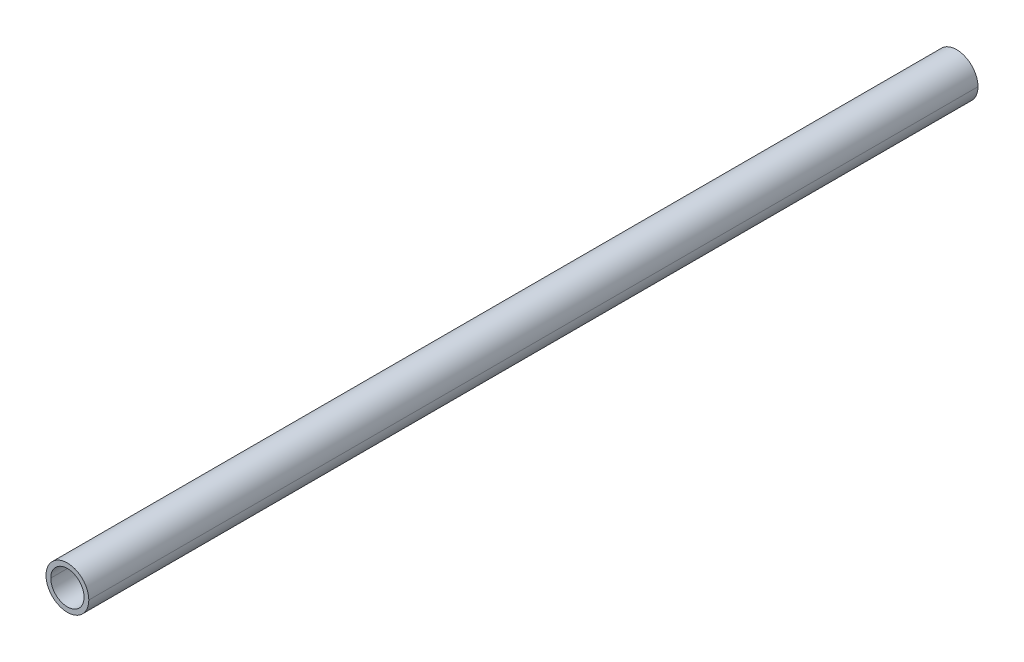
ISO-10303-21;
HEADER;
FILE_DESCRIPTION(('STEP AP214'),'2;1');
FILE_NAME('part.step','',(''),(''),'','','');
FILE_SCHEMA(('AUTOMOTIVE_DESIGN { 1 0 10303 214 1 1 1 1 }'));
ENDSEC;
DATA;
#1=APPLICATION_CONTEXT('core data for automotive mechanical design processes');
#2=APPLICATION_PROTOCOL_DEFINITION('international standard','automotive_design',2000,#1);
#3=PRODUCT_CONTEXT('',#1,'mechanical');
#4=PRODUCT('Part','Part','',(#3));
#5=PRODUCT_RELATED_PRODUCT_CATEGORY('part','',(#4));
#6=PRODUCT_DEFINITION_FORMATION('','',#4);
#7=PRODUCT_DEFINITION_CONTEXT('part definition',#1,'design');
#8=PRODUCT_DEFINITION('design','',#6,#7);
#9=PRODUCT_DEFINITION_SHAPE('','',#8);
#10=(LENGTH_UNIT() NAMED_UNIT(*) SI_UNIT(.MILLI.,.METRE.));
#11=(NAMED_UNIT(*) PLANE_ANGLE_UNIT() SI_UNIT($,.RADIAN.));
#12=(NAMED_UNIT(*) SI_UNIT($,.STERADIAN.) SOLID_ANGLE_UNIT());
#13=UNCERTAINTY_MEASURE_WITH_UNIT(LENGTH_MEASURE(1.E-05),#10,'distance_accuracy_value','');
#14=(GEOMETRIC_REPRESENTATION_CONTEXT(3) GLOBAL_UNCERTAINTY_ASSIGNED_CONTEXT((#13)) GLOBAL_UNIT_ASSIGNED_CONTEXT((#10,
#11,#12)) REPRESENTATION_CONTEXT('',''));
#15=CARTESIAN_POINT('',(0.,0.,0.));
#16=DIRECTION('',(0.,0.,1.));
#17=DIRECTION('',(1.,0.,0.));
#18=AXIS2_PLACEMENT_3D('',#15,#16,#17);
#19=CARTESIAN_POINT('',(0.,0.,373.98));
#20=DIRECTION('',(0.,0.,-1.));
#21=DIRECTION('',(-1.,0.,0.));
#22=AXIS2_PLACEMENT_3D('',#19,#20,#21);
#23=CYLINDRICAL_SURFACE('',#22,7.);
#24=DIRECTION('',(0.,0.,-1.));
#25=VECTOR('',#24,1.);
#26=CARTESIAN_POINT('',(7.,0.,373.98));
#27=LINE('',#26,#25);
#28=CARTESIAN_POINT('',(7.,0.,373.98));
#29=VERTEX_POINT('',#28);
#30=CARTESIAN_POINT('',(7.,0.,0.));
#31=VERTEX_POINT('',#30);
#32=EDGE_CURVE('E88',#29,#31,#27,.T.);
#33=ORIENTED_EDGE('',*,*,#32,.F.);
#34=CARTESIAN_POINT('',(0.,0.,373.98));
#35=DIRECTION('',(0.,0.,1.));
#36=DIRECTION('',(1.,0.,0.));
#37=AXIS2_PLACEMENT_3D('',#34,#35,#36);
#38=CIRCLE('',#37,7.);
#39=CARTESIAN_POINT('',(-7.,0.,373.98));
#40=VERTEX_POINT('',#39);
#41=EDGE_CURVE('E80',#29,#40,#38,.T.);
#42=ORIENTED_EDGE('',*,*,#41,.T.);
#43=DIRECTION('',(0.,0.,-1.));
#44=VECTOR('',#43,1.);
#45=CARTESIAN_POINT('',(-7.,0.,373.98));
#46=LINE('',#45,#44);
#47=CARTESIAN_POINT('',(-7.,0.,0.));
#48=VERTEX_POINT('',#47);
#49=EDGE_CURVE('E78',#40,#48,#46,.T.);
#50=ORIENTED_EDGE('',*,*,#49,.T.);
#51=CARTESIAN_POINT('',(0.,0.,0.));
#52=DIRECTION('',(0.,0.,1.));
#53=DIRECTION('',(1.,0.,0.));
#54=AXIS2_PLACEMENT_3D('',#51,#52,#53);
#55=CIRCLE('',#54,7.);
#56=EDGE_CURVE('E11',#31,#48,#55,.T.);
#57=ORIENTED_EDGE('',*,*,#56,.F.);
#58=EDGE_LOOP('',(#33,#42,#50,#57));
#59=FACE_BOUND('',#58,.T.);
#60=ADVANCED_FACE('F16',(#59),#23,.F.);
#61=CARTESIAN_POINT('',(0.,0.,373.98));
#62=DIRECTION('',(0.,0.,-1.));
#63=DIRECTION('',(-1.,0.,0.));
#64=AXIS2_PLACEMENT_3D('',#61,#62,#63);
#65=CYLINDRICAL_SURFACE('',#64,9.);
#66=DIRECTION('',(0.,0.,-1.));
#67=VECTOR('',#66,1.);
#68=CARTESIAN_POINT('',(9.,0.,373.98));
#69=LINE('',#68,#67);
#70=CARTESIAN_POINT('',(9.,0.,373.98));
#71=VERTEX_POINT('',#70);
#72=CARTESIAN_POINT('',(9.,0.,0.));
#73=VERTEX_POINT('',#72);
#74=EDGE_CURVE('E116',#71,#73,#69,.T.);
#75=ORIENTED_EDGE('',*,*,#74,.F.);
#76=CARTESIAN_POINT('',(0.,0.,373.98));
#77=DIRECTION('',(0.,0.,1.));
#78=DIRECTION('',(1.,0.,0.));
#79=AXIS2_PLACEMENT_3D('',#76,#77,#78);
#80=CIRCLE('',#79,9.);
#81=CARTESIAN_POINT('',(-9.,0.,373.98));
#82=VERTEX_POINT('',#81);
#83=EDGE_CURVE('E20',#82,#71,#80,.T.);
#84=ORIENTED_EDGE('',*,*,#83,.F.);
#85=DIRECTION('',(0.,0.,-1.));
#86=VECTOR('',#85,1.);
#87=CARTESIAN_POINT('',(-9.,0.,373.98));
#88=LINE('',#87,#86);
#89=CARTESIAN_POINT('',(-9.,0.,0.));
#90=VERTEX_POINT('',#89);
#91=EDGE_CURVE('E103',#82,#90,#88,.T.);
#92=ORIENTED_EDGE('',*,*,#91,.T.);
#93=CARTESIAN_POINT('',(0.,0.,0.));
#94=DIRECTION('',(0.,0.,1.));
#95=DIRECTION('',(1.,0.,0.));
#96=AXIS2_PLACEMENT_3D('',#93,#94,#95);
#97=CIRCLE('',#96,9.);
#98=EDGE_CURVE('E27',#90,#73,#97,.T.);
#99=ORIENTED_EDGE('',*,*,#98,.T.);
#100=EDGE_LOOP('',(#75,#84,#92,#99));
#101=FACE_BOUND('',#100,.T.);
#102=ADVANCED_FACE('F18',(#101),#65,.T.);
#103=CARTESIAN_POINT('',(0.,0.,0.));
#104=DIRECTION('',(0.,0.,1.));
#105=DIRECTION('',(1.,0.,0.));
#106=AXIS2_PLACEMENT_3D('',#103,#104,#105);
#107=PLANE('',#106);
#108=CARTESIAN_POINT('',(0.,0.,0.));
#109=DIRECTION('',(0.,0.,1.));
#110=DIRECTION('',(1.,0.,0.));
#111=AXIS2_PLACEMENT_3D('',#108,#109,#110);
#112=CIRCLE('',#111,7.);
#113=EDGE_CURVE('E72',#48,#31,#112,.T.);
#114=ORIENTED_EDGE('',*,*,#113,.T.);
#115=ORIENTED_EDGE('',*,*,#56,.T.);
#116=EDGE_LOOP('',(#114,#115));
#117=FACE_BOUND('',#116,.T.);
#118=ORIENTED_EDGE('',*,*,#98,.F.);
#119=CARTESIAN_POINT('',(0.,0.,0.));
#120=DIRECTION('',(0.,0.,1.));
#121=DIRECTION('',(1.,0.,0.));
#122=AXIS2_PLACEMENT_3D('',#119,#120,#121);
#123=CIRCLE('',#122,9.);
#124=EDGE_CURVE('E108',#73,#90,#123,.T.);
#125=ORIENTED_EDGE('',*,*,#124,.F.);
#126=EDGE_LOOP('',(#118,#125));
#127=FACE_BOUND('',#126,.T.);
#128=ADVANCED_FACE('F70',(#117,#127),#107,.F.);
#129=CARTESIAN_POINT('',(0.,0.,373.98));
#130=DIRECTION('',(0.,0.,1.));
#131=DIRECTION('',(1.,0.,0.));
#132=AXIS2_PLACEMENT_3D('',#129,#130,#131);
#133=PLANE('',#132);
#134=CARTESIAN_POINT('',(0.,0.,373.98));
#135=DIRECTION('',(0.,0.,1.));
#136=DIRECTION('',(1.,0.,0.));
#137=AXIS2_PLACEMENT_3D('',#134,#135,#136);
#138=CIRCLE('',#137,7.);
#139=EDGE_CURVE('E95',#40,#29,#138,.T.);
#140=ORIENTED_EDGE('',*,*,#139,.F.);
#141=ORIENTED_EDGE('',*,*,#41,.F.);
#142=EDGE_LOOP('',(#140,#141));
#143=FACE_BOUND('',#142,.T.);
#144=ORIENTED_EDGE('',*,*,#83,.T.);
#145=CARTESIAN_POINT('',(0.,0.,373.98));
#146=DIRECTION('',(0.,0.,1.));
#147=DIRECTION('',(1.,0.,0.));
#148=AXIS2_PLACEMENT_3D('',#145,#146,#147);
#149=CIRCLE('',#148,9.);
#150=EDGE_CURVE('E85',#71,#82,#149,.T.);
#151=ORIENTED_EDGE('',*,*,#150,.T.);
#152=EDGE_LOOP('',(#144,#151));
#153=FACE_BOUND('',#152,.T.);
#154=ADVANCED_FACE('F133',(#143,#153),#133,.T.);
#155=CARTESIAN_POINT('',(0.,0.,373.98));
#156=DIRECTION('',(0.,0.,-1.));
#157=DIRECTION('',(-1.,0.,0.));
#158=AXIS2_PLACEMENT_3D('',#155,#156,#157);
#159=CYLINDRICAL_SURFACE('',#158,9.);
#160=ORIENTED_EDGE('',*,*,#150,.F.);
#161=ORIENTED_EDGE('',*,*,#74,.T.);
#162=ORIENTED_EDGE('',*,*,#124,.T.);
#163=ORIENTED_EDGE('',*,*,#91,.F.);
#164=EDGE_LOOP('',(#160,#161,#162,#163));
#165=FACE_BOUND('',#164,.T.);
#166=ADVANCED_FACE('F213',(#165),#159,.T.);
#167=CARTESIAN_POINT('',(0.,0.,373.98));
#168=DIRECTION('',(0.,0.,-1.));
#169=DIRECTION('',(-1.,0.,0.));
#170=AXIS2_PLACEMENT_3D('',#167,#168,#169);
#171=CYLINDRICAL_SURFACE('',#170,7.);
#172=ORIENTED_EDGE('',*,*,#139,.T.);
#173=ORIENTED_EDGE('',*,*,#32,.T.);
#174=ORIENTED_EDGE('',*,*,#113,.F.);
#175=ORIENTED_EDGE('',*,*,#49,.F.);
#176=EDGE_LOOP('',(#172,#173,#174,#175));
#177=FACE_BOUND('',#176,.T.);
#178=ADVANCED_FACE('F87',(#177),#171,.F.);
#179=CLOSED_SHELL('',(#60,#102,#128,#154,#166,#178));
#180=MANIFOLD_SOLID_BREP('B1',#179);
#181=ADVANCED_BREP_SHAPE_REPRESENTATION('',(#18,#180),#14);
#182=SHAPE_DEFINITION_REPRESENTATION(#9,#181);
ENDSEC;
END-ISO-10303-21;
